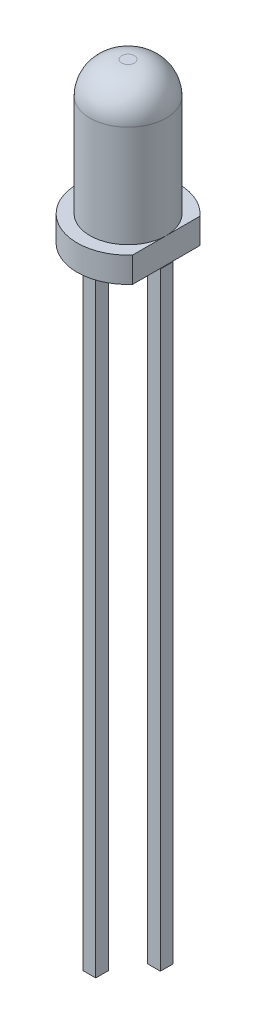
ISO-10303-21;
HEADER;
FILE_DESCRIPTION(('STEP AP214'),'2;1');
FILE_NAME('part.step','',(''),(''),'','','');
FILE_SCHEMA(('AUTOMOTIVE_DESIGN { 1 0 10303 214 1 1 1 1 }'));
ENDSEC;
DATA;
#1=APPLICATION_CONTEXT('core data for automotive mechanical design processes');
#2=APPLICATION_PROTOCOL_DEFINITION('international standard','automotive_design',2000,#1);
#3=PRODUCT_CONTEXT('',#1,'mechanical');
#4=PRODUCT('Part','Part','',(#3));
#5=PRODUCT_RELATED_PRODUCT_CATEGORY('part','',(#4));
#6=PRODUCT_DEFINITION_FORMATION('','',#4);
#7=PRODUCT_DEFINITION_CONTEXT('part definition',#1,'design');
#8=PRODUCT_DEFINITION('design','',#6,#7);
#9=PRODUCT_DEFINITION_SHAPE('','',#8);
#10=(LENGTH_UNIT() NAMED_UNIT(*) SI_UNIT(.MILLI.,.METRE.));
#11=(NAMED_UNIT(*) PLANE_ANGLE_UNIT() SI_UNIT($,.RADIAN.));
#12=(NAMED_UNIT(*) SI_UNIT($,.STERADIAN.) SOLID_ANGLE_UNIT());
#13=UNCERTAINTY_MEASURE_WITH_UNIT(LENGTH_MEASURE(1.E-05),#10,'distance_accuracy_value','');
#14=(GEOMETRIC_REPRESENTATION_CONTEXT(3) GLOBAL_UNCERTAINTY_ASSIGNED_CONTEXT((#13)) GLOBAL_UNIT_ASSIGNED_CONTEXT((#10,
#11,#12)) REPRESENTATION_CONTEXT('',''));
#15=CARTESIAN_POINT('',(0.,0.,0.));
#16=DIRECTION('',(0.,0.,1.));
#17=DIRECTION('',(1.,0.,0.));
#18=AXIS2_PLACEMENT_3D('',#15,#16,#17);
#19=CARTESIAN_POINT('',(1.02017272281868,-25.4,-0.25));
#20=DIRECTION('',(1.,0.,0.));
#21=DIRECTION('',(0.,0.,-1.));
#22=AXIS2_PLACEMENT_3D('',#19,#20,#21);
#23=PLANE('',#22);
#24=DIRECTION('',(0.,0.,-1.));
#25=VECTOR('',#24,1.);
#26=CARTESIAN_POINT('',(1.02017272281868,-23.9,0.25));
#27=LINE('',#26,#25);
#28=CARTESIAN_POINT('',(1.02017272281868,-23.9,0.25));
#29=VERTEX_POINT('',#28);
#30=CARTESIAN_POINT('',(1.02017272281868,-23.9,-0.25));
#31=VERTEX_POINT('',#30);
#32=EDGE_CURVE('E346',#29,#31,#27,.T.);
#33=ORIENTED_EDGE('',*,*,#32,.F.);
#34=DIRECTION('',(0.,1.,0.));
#35=VECTOR('',#34,1.);
#36=CARTESIAN_POINT('',(1.02017272281868,-25.4,0.25));
#37=LINE('',#36,#35);
#38=CARTESIAN_POINT('',(1.02017272281868,0.,0.25));
#39=VERTEX_POINT('',#38);
#40=EDGE_CURVE('E345',#29,#39,#37,.T.);
#41=ORIENTED_EDGE('',*,*,#40,.T.);
#42=DIRECTION('',(0.,0.,-1.));
#43=VECTOR('',#42,1.);
#44=CARTESIAN_POINT('',(1.02017272281868,0.,-0.25));
#45=LINE('',#44,#43);
#46=CARTESIAN_POINT('',(1.02017272281868,0.,-0.25));
#47=VERTEX_POINT('',#46);
#48=EDGE_CURVE('E417',#39,#47,#45,.T.);
#49=ORIENTED_EDGE('',*,*,#48,.T.);
#50=DIRECTION('',(0.,1.,0.));
#51=VECTOR('',#50,1.);
#52=CARTESIAN_POINT('',(1.02017272281868,-25.4,-0.25));
#53=LINE('',#52,#51);
#54=EDGE_CURVE('E354',#31,#47,#53,.T.);
#55=ORIENTED_EDGE('',*,*,#54,.F.);
#56=EDGE_LOOP('',(#33,#41,#49,#55));
#57=FACE_BOUND('',#56,.T.);
#58=ADVANCED_FACE('F37',(#57),#23,.F.);
#59=CARTESIAN_POINT('',(1.02017272281868,-25.4,-0.25));
#60=DIRECTION('',(0.,0.,1.));
#61=DIRECTION('',(1.,0.,0.));
#62=AXIS2_PLACEMENT_3D('',#59,#60,#61);
#63=PLANE('',#62);
#64=DIRECTION('',(1.,0.,0.));
#65=VECTOR('',#64,1.);
#66=CARTESIAN_POINT('',(1.02017272281868,-23.9,-0.25));
#67=LINE('',#66,#65);
#68=CARTESIAN_POINT('',(1.52017272281868,-23.9,-0.25));
#69=VERTEX_POINT('',#68);
#70=EDGE_CURVE('E414',#31,#69,#67,.T.);
#71=ORIENTED_EDGE('',*,*,#70,.F.);
#72=ORIENTED_EDGE('',*,*,#54,.T.);
#73=DIRECTION('',(1.,0.,0.));
#74=VECTOR('',#73,1.);
#75=CARTESIAN_POINT('',(1.02017272281868,0.,-0.25));
#76=LINE('',#75,#74);
#77=CARTESIAN_POINT('',(1.5,0.,-0.25));
#78=VERTEX_POINT('',#77);
#79=EDGE_CURVE('E420',#47,#78,#76,.T.);
#80=ORIENTED_EDGE('',*,*,#79,.T.);
#81=DIRECTION('',(-1.,0.,0.));
#82=VECTOR('',#81,1.);
#83=CARTESIAN_POINT('',(1.02017272281868,0.,-0.25));
#84=LINE('',#83,#82);
#85=CARTESIAN_POINT('',(1.52017272281868,0.,-0.25));
#86=VERTEX_POINT('',#85);
#87=EDGE_CURVE('E347',#86,#78,#84,.T.);
#88=ORIENTED_EDGE('',*,*,#87,.F.);
#89=DIRECTION('',(0.,1.,0.));
#90=VECTOR('',#89,1.);
#91=CARTESIAN_POINT('',(1.52017272281868,-25.4,-0.25));
#92=LINE('',#91,#90);
#93=EDGE_CURVE('E352',#69,#86,#92,.T.);
#94=ORIENTED_EDGE('',*,*,#93,.F.);
#95=EDGE_LOOP('',(#71,#72,#80,#88,#94));
#96=FACE_BOUND('',#95,.T.);
#97=ADVANCED_FACE('F164',(#96),#63,.F.);
#98=CARTESIAN_POINT('',(1.52017272281868,-25.4,-0.25));
#99=DIRECTION('',(-1.,0.,0.));
#100=DIRECTION('',(0.,0.,1.));
#101=AXIS2_PLACEMENT_3D('',#98,#99,#100);
#102=PLANE('',#101);
#103=DIRECTION('',(0.,0.,1.));
#104=VECTOR('',#103,1.);
#105=CARTESIAN_POINT('',(1.52017272281868,-23.9,-0.25));
#106=LINE('',#105,#104);
#107=CARTESIAN_POINT('',(1.52017272281868,-23.9,0.25));
#108=VERTEX_POINT('',#107);
#109=EDGE_CURVE('E60',#69,#108,#106,.T.);
#110=ORIENTED_EDGE('',*,*,#109,.F.);
#111=ORIENTED_EDGE('',*,*,#93,.T.);
#112=DIRECTION('',(0.,0.,1.));
#113=VECTOR('',#112,1.);
#114=CARTESIAN_POINT('',(1.52017272281868,0.,-0.25));
#115=LINE('',#114,#113);
#116=CARTESIAN_POINT('',(1.52017272281868,0.,0.25));
#117=VERTEX_POINT('',#116);
#118=EDGE_CURVE('E351',#86,#117,#115,.T.);
#119=ORIENTED_EDGE('',*,*,#118,.T.);
#120=DIRECTION('',(0.,1.,0.));
#121=VECTOR('',#120,1.);
#122=CARTESIAN_POINT('',(1.52017272281868,-25.4,0.25));
#123=LINE('',#122,#121);
#124=EDGE_CURVE('E342',#108,#117,#123,.T.);
#125=ORIENTED_EDGE('',*,*,#124,.F.);
#126=EDGE_LOOP('',(#110,#111,#119,#125));
#127=FACE_BOUND('',#126,.T.);
#128=ADVANCED_FACE('F170',(#127),#102,.F.);
#129=CARTESIAN_POINT('',(1.02017272281868,-25.4,0.25));
#130=DIRECTION('',(0.,0.,-1.));
#131=DIRECTION('',(-1.,0.,0.));
#132=AXIS2_PLACEMENT_3D('',#129,#130,#131);
#133=PLANE('',#132);
#134=DIRECTION('',(-1.,0.,0.));
#135=VECTOR('',#134,1.);
#136=CARTESIAN_POINT('',(1.52017272281868,-23.9,0.25));
#137=LINE('',#136,#135);
#138=EDGE_CURVE('E339',#108,#29,#137,.T.);
#139=ORIENTED_EDGE('',*,*,#138,.F.);
#140=ORIENTED_EDGE('',*,*,#124,.T.);
#141=DIRECTION('',(-1.,0.,0.));
#142=VECTOR('',#141,1.);
#143=CARTESIAN_POINT('',(1.02017272281868,0.,0.25));
#144=LINE('',#143,#142);
#145=CARTESIAN_POINT('',(1.5,0.,0.25));
#146=VERTEX_POINT('',#145);
#147=EDGE_CURVE('E356',#117,#146,#144,.T.);
#148=ORIENTED_EDGE('',*,*,#147,.T.);
#149=EDGE_CURVE('E408',#146,#39,#144,.T.);
#150=ORIENTED_EDGE('',*,*,#149,.T.);
#151=ORIENTED_EDGE('',*,*,#40,.F.);
#152=EDGE_LOOP('',(#139,#140,#148,#150,#151));
#153=FACE_BOUND('',#152,.T.);
#154=ADVANCED_FACE('F207',(#153),#133,.F.);
#155=CARTESIAN_POINT('',(0.,0.,0.));
#156=DIRECTION('',(0.,1.,0.));
#157=DIRECTION('',(0.,0.,1.));
#158=AXIS2_PLACEMENT_3D('',#155,#156,#157);
#159=PLANE('',#158);
#160=DIRECTION('',(0.,0.,-1.));
#161=VECTOR('',#160,1.);
#162=CARTESIAN_POINT('',(-1.52014292306889,0.,-0.25));
#163=LINE('',#162,#161);
#164=CARTESIAN_POINT('',(-1.52014292306889,0.,0.25));
#165=VERTEX_POINT('',#164);
#166=CARTESIAN_POINT('',(-1.52014292306889,0.,-0.25));
#167=VERTEX_POINT('',#166);
#168=EDGE_CURVE('E361',#165,#167,#163,.T.);
#169=ORIENTED_EDGE('',*,*,#168,.F.);
#170=DIRECTION('',(-1.,0.,0.));
#171=VECTOR('',#170,1.);
#172=CARTESIAN_POINT('',(-1.52014292306889,0.,0.25));
#173=LINE('',#172,#171);
#174=CARTESIAN_POINT('',(-1.02014292306889,0.,0.25));
#175=VERTEX_POINT('',#174);
#176=EDGE_CURVE('E366',#175,#165,#173,.T.);
#177=ORIENTED_EDGE('',*,*,#176,.F.);
#178=DIRECTION('',(0.,0.,1.));
#179=VECTOR('',#178,1.);
#180=CARTESIAN_POINT('',(-1.02014292306889,0.,-0.25));
#181=LINE('',#180,#179);
#182=CARTESIAN_POINT('',(-1.02014292306889,0.,-0.25));
#183=VERTEX_POINT('',#182);
#184=EDGE_CURVE('E378',#183,#175,#181,.T.);
#185=ORIENTED_EDGE('',*,*,#184,.F.);
#186=DIRECTION('',(1.,0.,0.));
#187=VECTOR('',#186,1.);
#188=CARTESIAN_POINT('',(-1.52014292306889,0.,-0.25));
#189=LINE('',#188,#187);
#190=EDGE_CURVE('E375',#167,#183,#189,.T.);
#191=ORIENTED_EDGE('',*,*,#190,.F.);
#192=EDGE_LOOP('',(#169,#177,#185,#191));
#193=FACE_BOUND('',#192,.T.);
#194=CARTESIAN_POINT('',(0.,0.,0.));
#195=DIRECTION('',(0.,1.,0.));
#196=DIRECTION('',(0.,0.,1.));
#197=AXIS2_PLACEMENT_3D('',#194,#195,#196);
#198=CIRCLE('',#197,2.);
#199=CARTESIAN_POINT('',(1.5,0.,-1.3228756555323));
#200=VERTEX_POINT('',#199);
#201=CARTESIAN_POINT('',(1.5,0.,1.32287565553229));
#202=VERTEX_POINT('',#201);
#203=EDGE_CURVE('E143',#200,#202,#198,.T.);
#204=ORIENTED_EDGE('',*,*,#203,.F.);
#205=DIRECTION('',(0.,0.,-1.));
#206=VECTOR('',#205,1.);
#207=CARTESIAN_POINT('',(1.5,0.,-2.73044739038099));
#208=LINE('',#207,#206);
#209=EDGE_CURVE('E127',#78,#200,#208,.T.);
#210=ORIENTED_EDGE('',*,*,#209,.F.);
#211=ORIENTED_EDGE('',*,*,#79,.F.);
#212=ORIENTED_EDGE('',*,*,#48,.F.);
#213=ORIENTED_EDGE('',*,*,#149,.F.);
#214=EDGE_CURVE('E406',#202,#146,#208,.T.);
#215=ORIENTED_EDGE('',*,*,#214,.F.);
#216=EDGE_LOOP('',(#204,#210,#211,#212,#213,#215));
#217=FACE_BOUND('',#216,.T.);
#218=ADVANCED_FACE('F205',(#193,#217),#159,.F.);
#219=CARTESIAN_POINT('',(0.,1.,0.));
#220=DIRECTION('',(0.,1.,0.));
#221=DIRECTION('',(0.,0.,1.));
#222=AXIS2_PLACEMENT_3D('',#219,#220,#221);
#223=PLANE('',#222);
#224=DIRECTION('',(0.,0.,1.));
#225=VECTOR('',#224,1.);
#226=CARTESIAN_POINT('',(1.5,1.,-2.73044739038099));
#227=LINE('',#226,#225);
#228=CARTESIAN_POINT('',(1.5,1.,-1.3228756555323));
#229=VERTEX_POINT('',#228);
#230=CARTESIAN_POINT('',(1.5,1.,0.));
#231=VERTEX_POINT('',#230);
#232=EDGE_CURVE('E124',#229,#231,#227,.T.);
#233=ORIENTED_EDGE('',*,*,#232,.F.);
#234=CARTESIAN_POINT('',(0.,1.,0.));
#235=DIRECTION('',(0.,1.,0.));
#236=DIRECTION('',(0.,0.,1.));
#237=AXIS2_PLACEMENT_3D('',#234,#235,#236);
#238=CIRCLE('',#237,2.);
#239=CARTESIAN_POINT('',(1.5,1.,1.32287565553229));
#240=VERTEX_POINT('',#239);
#241=EDGE_CURVE('E138',#229,#240,#238,.T.);
#242=ORIENTED_EDGE('',*,*,#241,.T.);
#243=EDGE_CURVE('E52',#231,#240,#227,.T.);
#244=ORIENTED_EDGE('',*,*,#243,.F.);
#245=CARTESIAN_POINT('',(0.,1.,0.));
#246=DIRECTION('',(0.,1.,0.));
#247=DIRECTION('',(0.,0.,1.));
#248=AXIS2_PLACEMENT_3D('',#245,#246,#247);
#249=CIRCLE('',#248,1.5);
#250=EDGE_CURVE('E140',#231,#231,#249,.T.);
#251=ORIENTED_EDGE('',*,*,#250,.F.);
#252=EDGE_LOOP('',(#233,#242,#244,#251));
#253=FACE_BOUND('',#252,.T.);
#254=ADVANCED_FACE('F137',(#253),#223,.T.);
#255=CARTESIAN_POINT('',(0.,1.,0.));
#256=DIRECTION('',(0.,-1.,0.));
#257=DIRECTION('',(0.,0.,-1.));
#258=AXIS2_PLACEMENT_3D('',#255,#256,#257);
#259=CYLINDRICAL_SURFACE('',#258,2.);
#260=ORIENTED_EDGE('',*,*,#241,.F.);
#261=DIRECTION('',(0.,-1.,0.));
#262=VECTOR('',#261,1.);
#263=CARTESIAN_POINT('',(1.5,1.,-1.3228756555323));
#264=LINE('',#263,#262);
#265=EDGE_CURVE('E121',#229,#200,#264,.T.);
#266=ORIENTED_EDGE('',*,*,#265,.T.);
#267=ORIENTED_EDGE('',*,*,#203,.T.);
#268=DIRECTION('',(0.,-1.,0.));
#269=VECTOR('',#268,1.);
#270=CARTESIAN_POINT('',(1.5,1.,1.32287565553229));
#271=LINE('',#270,#269);
#272=EDGE_CURVE('E132',#202,#240,#271,.F.);
#273=ORIENTED_EDGE('',*,*,#272,.T.);
#274=EDGE_LOOP('',(#260,#266,#267,#273));
#275=FACE_BOUND('',#274,.T.);
#276=ADVANCED_FACE('F142',(#275),#259,.T.);
#277=CARTESIAN_POINT('',(0.,6.25,0.));
#278=DIRECTION('',(0.,-1.,0.));
#279=DIRECTION('',(0.,0.,-1.));
#280=AXIS2_PLACEMENT_3D('',#277,#278,#279);
#281=CYLINDRICAL_SURFACE('',#280,1.5);
#282=CARTESIAN_POINT('',(0.,5.,0.));
#283=DIRECTION('',(0.,1.,0.));
#284=DIRECTION('',(0.,0.,1.));
#285=AXIS2_PLACEMENT_3D('',#282,#283,#284);
#286=CIRCLE('',#285,1.5);
#287=CARTESIAN_POINT('',(0.,5.,1.5));
#288=VERTEX_POINT('',#287);
#289=EDGE_CURVE('E12',#288,#288,#286,.F.);
#290=ORIENTED_EDGE('',*,*,#289,.T.);
#291=EDGE_LOOP('',(#290));
#292=FACE_BOUND('',#291,.T.);
#293=ORIENTED_EDGE('',*,*,#250,.T.);
#294=EDGE_LOOP('',(#293));
#295=FACE_BOUND('',#294,.T.);
#296=ADVANCED_FACE('F199',(#292,#295),#281,.T.);
#297=CARTESIAN_POINT('',(0.,6.25,0.));
#298=DIRECTION('',(0.,1.,0.));
#299=DIRECTION('',(0.,0.,1.));
#300=AXIS2_PLACEMENT_3D('',#297,#298,#299);
#301=PLANE('',#300);
#302=CARTESIAN_POINT('',(0.,6.25,0.));
#303=DIRECTION('',(0.,1.,0.));
#304=DIRECTION('',(0.,0.,1.));
#305=AXIS2_PLACEMENT_3D('',#302,#303,#304);
#306=CIRCLE('',#305,0.25);
#307=CARTESIAN_POINT('',(0.,6.25,0.25));
#308=VERTEX_POINT('',#307);
#309=EDGE_CURVE('E45',#308,#308,#306,.T.);
#310=ORIENTED_EDGE('',*,*,#309,.T.);
#311=EDGE_LOOP('',(#310));
#312=FACE_BOUND('',#311,.T.);
#313=ADVANCED_FACE('F152',(#312),#301,.T.);
#314=CARTESIAN_POINT('',(-1.52014292306889,-25.4,-0.25));
#315=DIRECTION('',(1.,0.,0.));
#316=DIRECTION('',(0.,0.,-1.));
#317=AXIS2_PLACEMENT_3D('',#314,#315,#316);
#318=PLANE('',#317);
#319=ORIENTED_EDGE('',*,*,#168,.T.);
#320=DIRECTION('',(0.,1.,0.));
#321=VECTOR('',#320,1.);
#322=CARTESIAN_POINT('',(-1.52014292306889,-25.4,-0.25));
#323=LINE('',#322,#321);
#324=CARTESIAN_POINT('',(-1.52014292306889,-25.4,-0.25));
#325=VERTEX_POINT('',#324);
#326=EDGE_CURVE('E390',#325,#167,#323,.T.);
#327=ORIENTED_EDGE('',*,*,#326,.F.);
#328=DIRECTION('',(0.,0.,-1.));
#329=VECTOR('',#328,1.);
#330=CARTESIAN_POINT('',(-1.52014292306889,-25.4,-0.25));
#331=LINE('',#330,#329);
#332=CARTESIAN_POINT('',(-1.52014292306889,-25.4,0.25));
#333=VERTEX_POINT('',#332);
#334=EDGE_CURVE('E362',#333,#325,#331,.T.);
#335=ORIENTED_EDGE('',*,*,#334,.F.);
#336=DIRECTION('',(0.,1.,0.));
#337=VECTOR('',#336,1.);
#338=CARTESIAN_POINT('',(-1.52014292306889,-25.4,0.25));
#339=LINE('',#338,#337);
#340=EDGE_CURVE('E372',#333,#165,#339,.T.);
#341=ORIENTED_EDGE('',*,*,#340,.T.);
#342=EDGE_LOOP('',(#319,#327,#335,#341));
#343=FACE_BOUND('',#342,.T.);
#344=ADVANCED_FACE('F192',(#343),#318,.F.);
#345=CARTESIAN_POINT('',(-1.52014292306889,-25.4,-0.25));
#346=DIRECTION('',(0.,0.,1.));
#347=DIRECTION('',(1.,0.,0.));
#348=AXIS2_PLACEMENT_3D('',#345,#346,#347);
#349=PLANE('',#348);
#350=ORIENTED_EDGE('',*,*,#190,.T.);
#351=DIRECTION('',(0.,1.,0.));
#352=VECTOR('',#351,1.);
#353=CARTESIAN_POINT('',(-1.02014292306889,-25.4,-0.25));
#354=LINE('',#353,#352);
#355=CARTESIAN_POINT('',(-1.02014292306889,-25.4,-0.25));
#356=VERTEX_POINT('',#355);
#357=EDGE_CURVE('E388',#356,#183,#354,.T.);
#358=ORIENTED_EDGE('',*,*,#357,.F.);
#359=DIRECTION('',(1.,0.,0.));
#360=VECTOR('',#359,1.);
#361=CARTESIAN_POINT('',(-1.52014292306889,-25.4,-0.25));
#362=LINE('',#361,#360);
#363=EDGE_CURVE('E365',#325,#356,#362,.T.);
#364=ORIENTED_EDGE('',*,*,#363,.F.);
#365=ORIENTED_EDGE('',*,*,#326,.T.);
#366=EDGE_LOOP('',(#350,#358,#364,#365));
#367=FACE_BOUND('',#366,.T.);
#368=ADVANCED_FACE('F188',(#367),#349,.F.);
#369=CARTESIAN_POINT('',(-1.02014292306889,-25.4,-0.25));
#370=DIRECTION('',(-1.,0.,0.));
#371=DIRECTION('',(0.,0.,1.));
#372=AXIS2_PLACEMENT_3D('',#369,#370,#371);
#373=PLANE('',#372);
#374=ORIENTED_EDGE('',*,*,#184,.T.);
#375=DIRECTION('',(0.,1.,0.));
#376=VECTOR('',#375,1.);
#377=CARTESIAN_POINT('',(-1.02014292306889,-25.4,0.25));
#378=LINE('',#377,#376);
#379=CARTESIAN_POINT('',(-1.02014292306889,-25.4,0.25));
#380=VERTEX_POINT('',#379);
#381=EDGE_CURVE('E385',#380,#175,#378,.T.);
#382=ORIENTED_EDGE('',*,*,#381,.F.);
#383=DIRECTION('',(0.,0.,1.));
#384=VECTOR('',#383,1.);
#385=CARTESIAN_POINT('',(-1.02014292306889,-25.4,-0.25));
#386=LINE('',#385,#384);
#387=EDGE_CURVE('E368',#356,#380,#386,.T.);
#388=ORIENTED_EDGE('',*,*,#387,.F.);
#389=ORIENTED_EDGE('',*,*,#357,.T.);
#390=EDGE_LOOP('',(#374,#382,#388,#389));
#391=FACE_BOUND('',#390,.T.);
#392=ADVANCED_FACE('F184',(#391),#373,.F.);
#393=CARTESIAN_POINT('',(-1.52014292306889,-25.4,0.25));
#394=DIRECTION('',(0.,0.,-1.));
#395=DIRECTION('',(-1.,0.,0.));
#396=AXIS2_PLACEMENT_3D('',#393,#394,#395);
#397=PLANE('',#396);
#398=ORIENTED_EDGE('',*,*,#176,.T.);
#399=ORIENTED_EDGE('',*,*,#340,.F.);
#400=DIRECTION('',(-1.,0.,0.));
#401=VECTOR('',#400,1.);
#402=CARTESIAN_POINT('',(-1.52014292306889,-25.4,0.25));
#403=LINE('',#402,#401);
#404=EDGE_CURVE('E370',#380,#333,#403,.T.);
#405=ORIENTED_EDGE('',*,*,#404,.F.);
#406=ORIENTED_EDGE('',*,*,#381,.T.);
#407=EDGE_LOOP('',(#398,#399,#405,#406));
#408=FACE_BOUND('',#407,.T.);
#409=ADVANCED_FACE('F180',(#408),#397,.F.);
#410=CARTESIAN_POINT('',(-1.52014292306889,-25.4,0.25));
#411=DIRECTION('',(0.,1.,0.));
#412=DIRECTION('',(0.,0.,1.));
#413=AXIS2_PLACEMENT_3D('',#410,#411,#412);
#414=PLANE('',#413);
#415=ORIENTED_EDGE('',*,*,#334,.T.);
#416=ORIENTED_EDGE('',*,*,#363,.T.);
#417=ORIENTED_EDGE('',*,*,#387,.T.);
#418=ORIENTED_EDGE('',*,*,#404,.T.);
#419=EDGE_LOOP('',(#415,#416,#417,#418));
#420=FACE_BOUND('',#419,.T.);
#421=ADVANCED_FACE('F176',(#420),#414,.F.);
#422=CARTESIAN_POINT('',(1.02017272281868,-23.9,0.25));
#423=DIRECTION('',(0.,-1.,0.));
#424=DIRECTION('',(0.,0.,-1.));
#425=AXIS2_PLACEMENT_3D('',#422,#423,#424);
#426=PLANE('',#425);
#427=ORIENTED_EDGE('',*,*,#138,.T.);
#428=ORIENTED_EDGE('',*,*,#32,.T.);
#429=ORIENTED_EDGE('',*,*,#70,.T.);
#430=ORIENTED_EDGE('',*,*,#109,.T.);
#431=EDGE_LOOP('',(#427,#428,#429,#430));
#432=FACE_BOUND('',#431,.T.);
#433=ADVANCED_FACE('F179',(#432),#426,.T.);
#434=CARTESIAN_POINT('',(1.5,-4.60977222864644,-2.73044739038099));
#435=DIRECTION('',(-1.,0.,0.));
#436=DIRECTION('',(0.,0.,1.));
#437=AXIS2_PLACEMENT_3D('',#434,#435,#436);
#438=PLANE('',#437);
#439=ORIENTED_EDGE('',*,*,#232,.T.);
#440=ORIENTED_EDGE('',*,*,#243,.T.);
#441=ORIENTED_EDGE('',*,*,#272,.F.);
#442=ORIENTED_EDGE('',*,*,#214,.T.);
#443=EDGE_CURVE('E409',#146,#78,#208,.T.);
#444=ORIENTED_EDGE('',*,*,#443,.T.);
#445=ORIENTED_EDGE('',*,*,#209,.T.);
#446=ORIENTED_EDGE('',*,*,#265,.F.);
#447=EDGE_LOOP('',(#439,#440,#441,#442,#444,#445,#446));
#448=FACE_BOUND('',#447,.T.);
#449=ADVANCED_FACE('F123',(#448),#438,.F.);
#450=CARTESIAN_POINT('',(0.,0.,0.));
#451=DIRECTION('',(0.,1.,0.));
#452=DIRECTION('',(0.,0.,1.));
#453=AXIS2_PLACEMENT_3D('',#450,#451,#452);
#454=PLANE('',#453);
#455=ORIENTED_EDGE('',*,*,#87,.T.);
#456=ORIENTED_EDGE('',*,*,#443,.F.);
#457=ORIENTED_EDGE('',*,*,#147,.F.);
#458=ORIENTED_EDGE('',*,*,#118,.F.);
#459=EDGE_LOOP('',(#455,#456,#457,#458));
#460=FACE_BOUND('',#459,.T.);
#461=ADVANCED_FACE('F155',(#460),#454,.T.);
#462=CARTESIAN_POINT('',(0.,5.,0.));
#463=DIRECTION('',(0.,1.,0.));
#464=DIRECTION('',(0.,0.,1.));
#465=AXIS2_PLACEMENT_3D('',#462,#463,#464);
#466=DEGENERATE_TOROIDAL_SURFACE('',#465,0.25,1.25,.T.);
#467=ORIENTED_EDGE('',*,*,#289,.F.);
#468=EDGE_LOOP('',(#467));
#469=FACE_BOUND('',#468,.T.);
#470=ORIENTED_EDGE('',*,*,#309,.F.);
#471=EDGE_LOOP('',(#470));
#472=FACE_BOUND('',#471,.T.);
#473=ADVANCED_FACE('F39',(#469,#472),#466,.T.);
#474=CLOSED_SHELL('',(#58,#97,#128,#154,#218,#254,#276,#296,#313,#344,#368,#392,#409,#421,#433,
#449,#461,#473));
#475=MANIFOLD_SOLID_BREP('B2',#474);
#476=ADVANCED_BREP_SHAPE_REPRESENTATION('',(#18,#475),#14);
#477=SHAPE_DEFINITION_REPRESENTATION(#9,#476);
ENDSEC;
END-ISO-10303-21;
